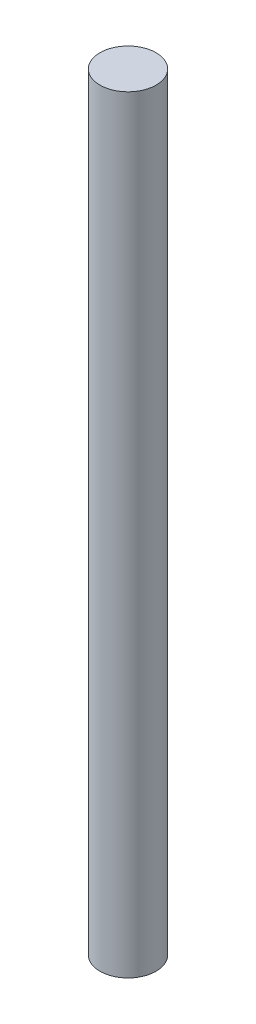
ISO-10303-21;
HEADER;
FILE_DESCRIPTION(('STEP AP214'),'2;1');
FILE_NAME('part.step','',(''),(''),'','','');
FILE_SCHEMA(('AUTOMOTIVE_DESIGN { 1 0 10303 214 1 1 1 1 }'));
ENDSEC;
DATA;
#1=APPLICATION_CONTEXT('core data for automotive mechanical design processes');
#2=APPLICATION_PROTOCOL_DEFINITION('international standard','automotive_design',2000,#1);
#3=PRODUCT_CONTEXT('',#1,'mechanical');
#4=PRODUCT('Part','Part','',(#3));
#5=PRODUCT_RELATED_PRODUCT_CATEGORY('part','',(#4));
#6=PRODUCT_DEFINITION_FORMATION('','',#4);
#7=PRODUCT_DEFINITION_CONTEXT('part definition',#1,'design');
#8=PRODUCT_DEFINITION('design','',#6,#7);
#9=PRODUCT_DEFINITION_SHAPE('','',#8);
#10=(LENGTH_UNIT() NAMED_UNIT(*) SI_UNIT(.MILLI.,.METRE.));
#11=(NAMED_UNIT(*) PLANE_ANGLE_UNIT() SI_UNIT($,.RADIAN.));
#12=(NAMED_UNIT(*) SI_UNIT($,.STERADIAN.) SOLID_ANGLE_UNIT());
#13=UNCERTAINTY_MEASURE_WITH_UNIT(LENGTH_MEASURE(1.E-05),#10,'distance_accuracy_value','');
#14=(GEOMETRIC_REPRESENTATION_CONTEXT(3) GLOBAL_UNCERTAINTY_ASSIGNED_CONTEXT((#13)) GLOBAL_UNIT_ASSIGNED_CONTEXT((#10,
#11,#12)) REPRESENTATION_CONTEXT('',''));
#15=CARTESIAN_POINT('',(0.,0.,0.));
#16=DIRECTION('',(0.,0.,1.));
#17=DIRECTION('',(1.,0.,0.));
#18=AXIS2_PLACEMENT_3D('',#15,#16,#17);
#19=CARTESIAN_POINT('',(0.,41.,0.));
#20=DIRECTION('',(0.,1.,0.));
#21=DIRECTION('',(0.,0.,1.));
#22=AXIS2_PLACEMENT_3D('',#19,#20,#21);
#23=PLANE('',#22);
#24=CARTESIAN_POINT('',(0.,41.,0.));
#25=DIRECTION('',(0.,-1.,0.));
#26=DIRECTION('',(0.,0.,-1.));
#27=AXIS2_PLACEMENT_3D('',#24,#25,#26);
#28=CIRCLE('',#27,1.5);
#29=CARTESIAN_POINT('',(0.,41.,-1.5));
#30=VERTEX_POINT('',#29);
#31=EDGE_CURVE('E18',#30,#30,#28,.T.);
#32=ORIENTED_EDGE('',*,*,#31,.F.);
#33=EDGE_LOOP('',(#32));
#34=FACE_BOUND('',#33,.T.);
#35=ADVANCED_FACE('F15',(#34),#23,.T.);
#36=CARTESIAN_POINT('',(0.,0.,0.));
#37=DIRECTION('',(0.,1.,0.));
#38=DIRECTION('',(0.,0.,1.));
#39=AXIS2_PLACEMENT_3D('',#36,#37,#38);
#40=PLANE('',#39);
#41=CARTESIAN_POINT('',(0.,0.,0.));
#42=DIRECTION('',(0.,-1.,0.));
#43=DIRECTION('',(0.,0.,-1.));
#44=AXIS2_PLACEMENT_3D('',#41,#42,#43);
#45=CIRCLE('',#44,1.5);
#46=CARTESIAN_POINT('',(0.,0.,-1.5));
#47=VERTEX_POINT('',#46);
#48=EDGE_CURVE('E10',#47,#47,#45,.F.);
#49=ORIENTED_EDGE('',*,*,#48,.F.);
#50=EDGE_LOOP('',(#49));
#51=FACE_BOUND('',#50,.T.);
#52=ADVANCED_FACE('F30',(#51),#40,.F.);
#53=CARTESIAN_POINT('',(0.,41.,0.));
#54=DIRECTION('',(0.,-1.,0.));
#55=DIRECTION('',(0.,0.,-1.));
#56=AXIS2_PLACEMENT_3D('',#53,#54,#55);
#57=CYLINDRICAL_SURFACE('',#56,1.5);
#58=ORIENTED_EDGE('',*,*,#48,.T.);
#59=EDGE_LOOP('',(#58));
#60=FACE_BOUND('',#59,.T.);
#61=ORIENTED_EDGE('',*,*,#31,.T.);
#62=EDGE_LOOP('',(#61));
#63=FACE_BOUND('',#62,.T.);
#64=ADVANCED_FACE('F27',(#60,#63),#57,.T.);
#65=CLOSED_SHELL('',(#35,#52,#64));
#66=MANIFOLD_SOLID_BREP('B1',#65);
#67=ADVANCED_BREP_SHAPE_REPRESENTATION('',(#18,#66),#14);
#68=SHAPE_DEFINITION_REPRESENTATION(#9,#67);
ENDSEC;
END-ISO-10303-21;
